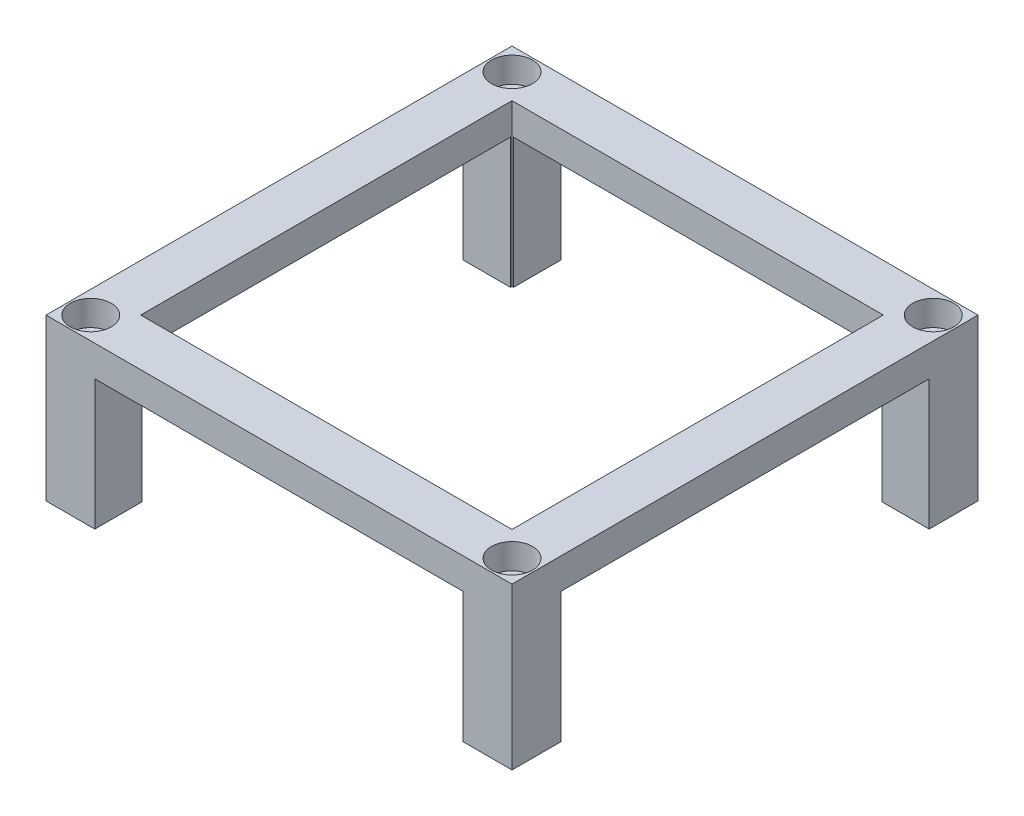
ISO-10303-21;
HEADER;
FILE_DESCRIPTION(('STEP AP214'),'2;1');
FILE_NAME('part.step','',(''),(''),'','','');
FILE_SCHEMA(('AUTOMOTIVE_DESIGN { 1 0 10303 214 1 1 1 1 }'));
ENDSEC;
DATA;
#1=APPLICATION_CONTEXT('core data for automotive mechanical design processes');
#2=APPLICATION_PROTOCOL_DEFINITION('international standard','automotive_design',2000,#1);
#3=PRODUCT_CONTEXT('',#1,'mechanical');
#4=PRODUCT('Part','Part','',(#3));
#5=PRODUCT_RELATED_PRODUCT_CATEGORY('part','',(#4));
#6=PRODUCT_DEFINITION_FORMATION('','',#4);
#7=PRODUCT_DEFINITION_CONTEXT('part definition',#1,'design');
#8=PRODUCT_DEFINITION('design','',#6,#7);
#9=PRODUCT_DEFINITION_SHAPE('','',#8);
#10=(LENGTH_UNIT() NAMED_UNIT(*) SI_UNIT(.MILLI.,.METRE.));
#11=(NAMED_UNIT(*) PLANE_ANGLE_UNIT() SI_UNIT($,.RADIAN.));
#12=(NAMED_UNIT(*) SI_UNIT($,.STERADIAN.) SOLID_ANGLE_UNIT());
#13=UNCERTAINTY_MEASURE_WITH_UNIT(LENGTH_MEASURE(1.E-05),#10,'distance_accuracy_value','');
#14=(GEOMETRIC_REPRESENTATION_CONTEXT(3) GLOBAL_UNCERTAINTY_ASSIGNED_CONTEXT((#13)) GLOBAL_UNIT_ASSIGNED_CONTEXT((#10,
#11,#12)) REPRESENTATION_CONTEXT('',''));
#15=CARTESIAN_POINT('',(0.,0.,0.));
#16=DIRECTION('',(0.,0.,1.));
#17=DIRECTION('',(1.,0.,0.));
#18=AXIS2_PLACEMENT_3D('',#15,#16,#17);
#19=CARTESIAN_POINT('',(0.,43.18,-125.));
#20=DIRECTION('',(0.,-1.,0.));
#21=DIRECTION('',(0.,0.,-1.));
#22=AXIS2_PLACEMENT_3D('',#19,#20,#21);
#23=PLANE('',#22);
#24=CARTESIAN_POINT('',(119.,43.18,-6.));
#25=DIRECTION('',(0.,1.,0.));
#26=DIRECTION('',(0.,0.,1.));
#27=AXIS2_PLACEMENT_3D('',#24,#25,#26);
#28=CIRCLE('',#27,5.50000000000001);
#29=CARTESIAN_POINT('',(119.,43.18,-0.499999999999995));
#30=VERTEX_POINT('',#29);
#31=EDGE_CURVE('E806',#30,#30,#28,.T.);
#32=ORIENTED_EDGE('',*,*,#31,.F.);
#33=EDGE_LOOP('',(#32));
#34=FACE_BOUND('',#33,.T.);
#35=CARTESIAN_POINT('',(119.,43.18,-119.));
#36=DIRECTION('',(0.,1.,0.));
#37=DIRECTION('',(0.,0.,1.));
#38=AXIS2_PLACEMENT_3D('',#35,#36,#37);
#39=CIRCLE('',#38,5.50000000000001);
#40=CARTESIAN_POINT('',(119.,43.18,-113.5));
#41=VERTEX_POINT('',#40);
#42=EDGE_CURVE('E499',#41,#41,#39,.T.);
#43=ORIENTED_EDGE('',*,*,#42,.F.);
#44=EDGE_LOOP('',(#43));
#45=FACE_BOUND('',#44,.T.);
#46=CARTESIAN_POINT('',(6.00000000000001,43.18,-119.));
#47=DIRECTION('',(0.,1.,0.));
#48=DIRECTION('',(0.,0.,1.));
#49=AXIS2_PLACEMENT_3D('',#46,#47,#48);
#50=CIRCLE('',#49,5.5);
#51=CARTESIAN_POINT('',(6.00000000000001,43.18,-113.5));
#52=VERTEX_POINT('',#51);
#53=EDGE_CURVE('E421',#52,#52,#50,.T.);
#54=ORIENTED_EDGE('',*,*,#53,.F.);
#55=EDGE_LOOP('',(#54));
#56=FACE_BOUND('',#55,.T.);
#57=DIRECTION('',(1.,0.,0.));
#58=VECTOR('',#57,1.);
#59=CARTESIAN_POINT('',(12.7,43.18,-12.7));
#60=LINE('',#59,#58);
#61=CARTESIAN_POINT('',(12.7,43.18,-12.7));
#62=VERTEX_POINT('',#61);
#63=CARTESIAN_POINT('',(112.3,43.18,-12.7));
#64=VERTEX_POINT('',#63);
#65=EDGE_CURVE('E355',#62,#64,#60,.T.);
#66=ORIENTED_EDGE('',*,*,#65,.F.);
#67=DIRECTION('',(0.,0.,1.));
#68=VECTOR('',#67,1.);
#69=CARTESIAN_POINT('',(12.7,43.18,-112.3));
#70=LINE('',#69,#68);
#71=CARTESIAN_POINT('',(12.7,43.18,-112.3));
#72=VERTEX_POINT('',#71);
#73=EDGE_CURVE('E337',#72,#62,#70,.T.);
#74=ORIENTED_EDGE('',*,*,#73,.F.);
#75=DIRECTION('',(-1.,0.,0.));
#76=VECTOR('',#75,1.);
#77=CARTESIAN_POINT('',(12.7,43.18,-112.3));
#78=LINE('',#77,#76);
#79=CARTESIAN_POINT('',(112.3,43.18,-112.3));
#80=VERTEX_POINT('',#79);
#81=EDGE_CURVE('E361',#80,#72,#78,.T.);
#82=ORIENTED_EDGE('',*,*,#81,.F.);
#83=DIRECTION('',(0.,0.,-1.));
#84=VECTOR('',#83,1.);
#85=CARTESIAN_POINT('',(112.3,43.18,-112.3));
#86=LINE('',#85,#84);
#87=EDGE_CURVE('E358',#64,#80,#86,.T.);
#88=ORIENTED_EDGE('',*,*,#87,.F.);
#89=EDGE_LOOP('',(#66,#74,#82,#88));
#90=FACE_BOUND('',#89,.T.);
#91=DIRECTION('',(0.,0.,1.));
#92=VECTOR('',#91,1.);
#93=CARTESIAN_POINT('',(0.,43.18,0.));
#94=LINE('',#93,#92);
#95=CARTESIAN_POINT('',(0.,43.18,-125.));
#96=VERTEX_POINT('',#95);
#97=CARTESIAN_POINT('',(0.,43.18,0.));
#98=VERTEX_POINT('',#97);
#99=EDGE_CURVE('E244',#96,#98,#94,.T.);
#100=ORIENTED_EDGE('',*,*,#99,.T.);
#101=DIRECTION('',(1.,0.,0.));
#102=VECTOR('',#101,1.);
#103=CARTESIAN_POINT('',(0.,43.18,0.));
#104=LINE('',#103,#102);
#105=CARTESIAN_POINT('',(125.,43.18,0.));
#106=VERTEX_POINT('',#105);
#107=EDGE_CURVE('E371',#98,#106,#104,.T.);
#108=ORIENTED_EDGE('',*,*,#107,.T.);
#109=DIRECTION('',(0.,0.,-1.));
#110=VECTOR('',#109,1.);
#111=CARTESIAN_POINT('',(125.,43.18,0.));
#112=LINE('',#111,#110);
#113=CARTESIAN_POINT('',(125.,43.18,-125.));
#114=VERTEX_POINT('',#113);
#115=EDGE_CURVE('E372',#106,#114,#112,.T.);
#116=ORIENTED_EDGE('',*,*,#115,.T.);
#117=DIRECTION('',(-1.,0.,0.));
#118=VECTOR('',#117,1.);
#119=CARTESIAN_POINT('',(0.,43.18,-125.));
#120=LINE('',#119,#118);
#121=EDGE_CURVE('E233',#114,#96,#120,.T.);
#122=ORIENTED_EDGE('',*,*,#121,.T.);
#123=EDGE_LOOP('',(#100,#108,#116,#122));
#124=FACE_BOUND('',#123,.T.);
#125=CARTESIAN_POINT('',(6.,43.18,-6.00000000000001));
#126=DIRECTION('',(0.,1.,0.));
#127=DIRECTION('',(0.,0.,1.));
#128=AXIS2_PLACEMENT_3D('',#125,#126,#127);
#129=CIRCLE('',#128,5.5);
#130=CARTESIAN_POINT('',(6.,43.18,-0.500000000000006));
#131=VERTEX_POINT('',#130);
#132=EDGE_CURVE('E791',#131,#131,#129,.T.);
#133=ORIENTED_EDGE('',*,*,#132,.F.);
#134=EDGE_LOOP('',(#133));
#135=FACE_BOUND('',#134,.T.);
#136=ADVANCED_FACE('F34',(#34,#45,#56,#90,#124,#135),#23,.F.);
#137=CARTESIAN_POINT('',(0.,0.,-125.));
#138=DIRECTION('',(0.,-1.,0.));
#139=DIRECTION('',(0.,0.,-1.));
#140=AXIS2_PLACEMENT_3D('',#137,#138,#139);
#141=PLANE('',#140);
#142=DIRECTION('',(1.,0.,0.));
#143=VECTOR('',#142,1.);
#144=CARTESIAN_POINT('',(0.,0.,-13.0925824));
#145=LINE('',#144,#143);
#146=CARTESIAN_POINT('',(112.3,0.,-13.0925824));
#147=VERTEX_POINT('',#146);
#148=CARTESIAN_POINT('',(125.,0.,-13.0925824));
#149=VERTEX_POINT('',#148);
#150=EDGE_CURVE('E207',#147,#149,#145,.T.);
#151=ORIENTED_EDGE('',*,*,#150,.T.);
#152=DIRECTION('',(0.,0.,-1.));
#153=VECTOR('',#152,1.);
#154=CARTESIAN_POINT('',(125.,0.,0.));
#155=LINE('',#154,#153);
#156=CARTESIAN_POINT('',(125.,0.,0.));
#157=VERTEX_POINT('',#156);
#158=EDGE_CURVE('E237',#157,#149,#155,.T.);
#159=ORIENTED_EDGE('',*,*,#158,.F.);
#160=DIRECTION('',(1.,0.,0.));
#161=VECTOR('',#160,1.);
#162=CARTESIAN_POINT('',(0.,0.,0.));
#163=LINE('',#162,#161);
#164=CARTESIAN_POINT('',(111.9074176,0.,0.));
#165=VERTEX_POINT('',#164);
#166=EDGE_CURVE('E228',#165,#157,#163,.T.);
#167=ORIENTED_EDGE('',*,*,#166,.F.);
#168=DIRECTION('',(0.,0.,1.));
#169=VECTOR('',#168,1.);
#170=CARTESIAN_POINT('',(111.9074176,0.,-125.));
#171=LINE('',#170,#169);
#172=CARTESIAN_POINT('',(111.9074176,0.,-12.7));
#173=VERTEX_POINT('',#172);
#174=EDGE_CURVE('E325',#173,#165,#171,.T.);
#175=ORIENTED_EDGE('',*,*,#174,.F.);
#176=DIRECTION('',(1.,0.,0.));
#177=VECTOR('',#176,1.);
#178=CARTESIAN_POINT('',(12.7,0.,-12.7));
#179=LINE('',#178,#177);
#180=CARTESIAN_POINT('',(112.3,0.,-12.7));
#181=VERTEX_POINT('',#180);
#182=EDGE_CURVE('E341',#173,#181,#179,.T.);
#183=ORIENTED_EDGE('',*,*,#182,.T.);
#184=DIRECTION('',(0.,0.,-1.));
#185=VECTOR('',#184,1.);
#186=CARTESIAN_POINT('',(112.3,0.,-112.3));
#187=LINE('',#186,#185);
#188=EDGE_CURVE('E347',#181,#147,#187,.T.);
#189=ORIENTED_EDGE('',*,*,#188,.T.);
#190=EDGE_LOOP('',(#151,#159,#167,#175,#183,#189));
#191=FACE_BOUND('',#190,.T.);
#192=CARTESIAN_POINT('',(119.,0.,-6.));
#193=DIRECTION('',(0.,1.,0.));
#194=DIRECTION('',(0.,0.,1.));
#195=AXIS2_PLACEMENT_3D('',#192,#193,#194);
#196=CIRCLE('',#195,3.29999999999998);
#197=CARTESIAN_POINT('',(119.,0.,-2.70000000000002));
#198=VERTEX_POINT('',#197);
#199=EDGE_CURVE('E797',#198,#198,#196,.T.);
#200=ORIENTED_EDGE('',*,*,#199,.T.);
#201=EDGE_LOOP('',(#200));
#202=FACE_BOUND('',#201,.T.);
#203=ADVANCED_FACE('F426',(#191,#202),#141,.T.);
#204=DIRECTION('',(1.,0.,0.));
#205=VECTOR('',#204,1.);
#206=CARTESIAN_POINT('',(0.,0.,-111.9074176));
#207=LINE('',#206,#205);
#208=CARTESIAN_POINT('',(112.3,0.,-111.9074176));
#209=VERTEX_POINT('',#208);
#210=CARTESIAN_POINT('',(125.,0.,-111.9074176));
#211=VERTEX_POINT('',#210);
#212=EDGE_CURVE('E206',#209,#211,#207,.T.);
#213=ORIENTED_EDGE('',*,*,#212,.F.);
#214=CARTESIAN_POINT('',(112.3,0.,-112.3));
#215=VERTEX_POINT('',#214);
#216=EDGE_CURVE('E346',#209,#215,#187,.T.);
#217=ORIENTED_EDGE('',*,*,#216,.T.);
#218=DIRECTION('',(-1.,0.,0.));
#219=VECTOR('',#218,1.);
#220=CARTESIAN_POINT('',(12.7,0.,-112.3));
#221=LINE('',#220,#219);
#222=CARTESIAN_POINT('',(111.9074176,0.,-112.3));
#223=VERTEX_POINT('',#222);
#224=EDGE_CURVE('E350',#215,#223,#221,.T.);
#225=ORIENTED_EDGE('',*,*,#224,.T.);
#226=CARTESIAN_POINT('',(111.9074176,0.,-125.));
#227=VERTEX_POINT('',#226);
#228=EDGE_CURVE('E323',#227,#223,#171,.T.);
#229=ORIENTED_EDGE('',*,*,#228,.F.);
#230=DIRECTION('',(-1.,0.,0.));
#231=VECTOR('',#230,1.);
#232=CARTESIAN_POINT('',(0.,0.,-125.));
#233=LINE('',#232,#231);
#234=CARTESIAN_POINT('',(125.,0.,-125.));
#235=VERTEX_POINT('',#234);
#236=EDGE_CURVE('E241',#235,#227,#233,.T.);
#237=ORIENTED_EDGE('',*,*,#236,.F.);
#238=EDGE_CURVE('E236',#211,#235,#155,.T.);
#239=ORIENTED_EDGE('',*,*,#238,.F.);
#240=EDGE_LOOP('',(#213,#217,#225,#229,#237,#239));
#241=FACE_BOUND('',#240,.T.);
#242=CARTESIAN_POINT('',(119.,0.,-119.));
#243=DIRECTION('',(0.,1.,0.));
#244=DIRECTION('',(0.,0.,1.));
#245=AXIS2_PLACEMENT_3D('',#242,#243,#244);
#246=CIRCLE('',#245,3.29999999999998);
#247=CARTESIAN_POINT('',(119.,0.,-115.7));
#248=VERTEX_POINT('',#247);
#249=EDGE_CURVE('E809',#248,#248,#246,.T.);
#250=ORIENTED_EDGE('',*,*,#249,.T.);
#251=EDGE_LOOP('',(#250));
#252=FACE_BOUND('',#251,.T.);
#253=ADVANCED_FACE('F399',(#241,#252),#141,.T.);
#254=CARTESIAN_POINT('',(6.,0.,-6.00000000000001));
#255=DIRECTION('',(0.,1.,0.));
#256=DIRECTION('',(0.,0.,1.));
#257=AXIS2_PLACEMENT_3D('',#254,#255,#256);
#258=CIRCLE('',#257,3.29999999999999);
#259=CARTESIAN_POINT('',(6.,0.,-2.70000000000002));
#260=VERTEX_POINT('',#259);
#261=EDGE_CURVE('E784',#260,#260,#258,.T.);
#262=ORIENTED_EDGE('',*,*,#261,.T.);
#263=EDGE_LOOP('',(#262));
#264=FACE_BOUND('',#263,.T.);
#265=CARTESIAN_POINT('',(0.,0.,-13.0925824));
#266=VERTEX_POINT('',#265);
#267=CARTESIAN_POINT('',(12.7,0.,-13.0925824));
#268=VERTEX_POINT('',#267);
#269=EDGE_CURVE('E195',#266,#268,#145,.T.);
#270=ORIENTED_EDGE('',*,*,#269,.T.);
#271=DIRECTION('',(0.,0.,1.));
#272=VECTOR('',#271,1.);
#273=CARTESIAN_POINT('',(12.7,0.,-112.3));
#274=LINE('',#273,#272);
#275=CARTESIAN_POINT('',(12.7,0.,-12.7));
#276=VERTEX_POINT('',#275);
#277=EDGE_CURVE('E342',#268,#276,#274,.T.);
#278=ORIENTED_EDGE('',*,*,#277,.T.);
#279=CARTESIAN_POINT('',(13.0925824,0.,-12.7));
#280=VERTEX_POINT('',#279);
#281=EDGE_CURVE('E343',#276,#280,#179,.T.);
#282=ORIENTED_EDGE('',*,*,#281,.T.);
#283=DIRECTION('',(0.,0.,1.));
#284=VECTOR('',#283,1.);
#285=CARTESIAN_POINT('',(13.0925824,0.,-125.));
#286=LINE('',#285,#284);
#287=CARTESIAN_POINT('',(13.0925824,0.,0.));
#288=VERTEX_POINT('',#287);
#289=EDGE_CURVE('E307',#280,#288,#286,.T.);
#290=ORIENTED_EDGE('',*,*,#289,.T.);
#291=CARTESIAN_POINT('',(0.,0.,0.));
#292=VERTEX_POINT('',#291);
#293=EDGE_CURVE('E222',#292,#288,#163,.T.);
#294=ORIENTED_EDGE('',*,*,#293,.F.);
#295=DIRECTION('',(0.,0.,1.));
#296=VECTOR('',#295,1.);
#297=CARTESIAN_POINT('',(0.,0.,0.));
#298=LINE('',#297,#296);
#299=EDGE_CURVE('E211',#266,#292,#298,.T.);
#300=ORIENTED_EDGE('',*,*,#299,.F.);
#301=EDGE_LOOP('',(#270,#278,#282,#290,#294,#300));
#302=FACE_BOUND('',#301,.T.);
#303=ADVANCED_FACE('F219',(#264,#302),#141,.T.);
#304=CARTESIAN_POINT('',(6.00000000000001,0.,-119.));
#305=DIRECTION('',(0.,1.,0.));
#306=DIRECTION('',(0.,0.,1.));
#307=AXIS2_PLACEMENT_3D('',#304,#305,#306);
#308=CIRCLE('',#307,3.29999999999999);
#309=CARTESIAN_POINT('',(6.00000000000001,0.,-115.7));
#310=VERTEX_POINT('',#309);
#311=EDGE_CURVE('E496',#310,#310,#308,.T.);
#312=ORIENTED_EDGE('',*,*,#311,.T.);
#313=EDGE_LOOP('',(#312));
#314=FACE_BOUND('',#313,.T.);
#315=CARTESIAN_POINT('',(0.,0.,-111.9074176));
#316=VERTEX_POINT('',#315);
#317=CARTESIAN_POINT('',(12.7,0.,-111.9074176));
#318=VERTEX_POINT('',#317);
#319=EDGE_CURVE('E49',#316,#318,#207,.T.);
#320=ORIENTED_EDGE('',*,*,#319,.F.);
#321=CARTESIAN_POINT('',(0.,0.,-125.));
#322=VERTEX_POINT('',#321);
#323=EDGE_CURVE('E224',#322,#316,#298,.T.);
#324=ORIENTED_EDGE('',*,*,#323,.F.);
#325=CARTESIAN_POINT('',(13.0925824,0.,-125.));
#326=VERTEX_POINT('',#325);
#327=EDGE_CURVE('E240',#326,#322,#233,.T.);
#328=ORIENTED_EDGE('',*,*,#327,.F.);
#329=CARTESIAN_POINT('',(13.0925824,0.,-112.3));
#330=VERTEX_POINT('',#329);
#331=EDGE_CURVE('E326',#326,#330,#286,.T.);
#332=ORIENTED_EDGE('',*,*,#331,.T.);
#333=CARTESIAN_POINT('',(12.7,0.,-112.3));
#334=VERTEX_POINT('',#333);
#335=EDGE_CURVE('E349',#330,#334,#221,.T.);
#336=ORIENTED_EDGE('',*,*,#335,.T.);
#337=EDGE_CURVE('E338',#334,#318,#274,.T.);
#338=ORIENTED_EDGE('',*,*,#337,.T.);
#339=EDGE_LOOP('',(#320,#324,#328,#332,#336,#338));
#340=FACE_BOUND('',#339,.T.);
#341=ADVANCED_FACE('F414',(#314,#340),#141,.T.);
#342=CARTESIAN_POINT('',(0.,43.18,0.));
#343=DIRECTION('',(1.,0.,0.));
#344=DIRECTION('',(0.,0.,-1.));
#345=AXIS2_PLACEMENT_3D('',#342,#343,#344);
#346=PLANE('',#345);
#347=DIRECTION('',(0.,0.,1.));
#348=VECTOR('',#347,1.);
#349=CARTESIAN_POINT('',(0.,34.925,-13.0925824));
#350=LINE('',#349,#348);
#351=CARTESIAN_POINT('',(0.,34.925,-111.9074176));
#352=VERTEX_POINT('',#351);
#353=CARTESIAN_POINT('',(0.,34.925,-13.0925824));
#354=VERTEX_POINT('',#353);
#355=EDGE_CURVE('E215',#352,#354,#350,.T.);
#356=ORIENTED_EDGE('',*,*,#355,.T.);
#357=DIRECTION('',(0.,-1.,0.));
#358=VECTOR('',#357,1.);
#359=CARTESIAN_POINT('',(0.,0.,-13.0925824));
#360=LINE('',#359,#358);
#361=EDGE_CURVE('E199',#354,#266,#360,.T.);
#362=ORIENTED_EDGE('',*,*,#361,.T.);
#363=ORIENTED_EDGE('',*,*,#299,.T.);
#364=DIRECTION('',(0.,-1.,0.));
#365=VECTOR('',#364,1.);
#366=CARTESIAN_POINT('',(0.,43.18,0.));
#367=LINE('',#366,#365);
#368=EDGE_CURVE('E254',#98,#292,#367,.T.);
#369=ORIENTED_EDGE('',*,*,#368,.F.);
#370=ORIENTED_EDGE('',*,*,#99,.F.);
#371=DIRECTION('',(0.,-1.,0.));
#372=VECTOR('',#371,1.);
#373=CARTESIAN_POINT('',(0.,43.18,-125.));
#374=LINE('',#373,#372);
#375=EDGE_CURVE('E245',#96,#322,#374,.T.);
#376=ORIENTED_EDGE('',*,*,#375,.T.);
#377=ORIENTED_EDGE('',*,*,#323,.T.);
#378=DIRECTION('',(0.,1.,0.));
#379=VECTOR('',#378,1.);
#380=CARTESIAN_POINT('',(0.,0.,-111.9074176));
#381=LINE('',#380,#379);
#382=EDGE_CURVE('E216',#316,#352,#381,.T.);
#383=ORIENTED_EDGE('',*,*,#382,.T.);
#384=EDGE_LOOP('',(#356,#362,#363,#369,#370,#376,#377,#383));
#385=FACE_BOUND('',#384,.T.);
#386=ADVANCED_FACE('F36',(#385),#346,.F.);
#387=CARTESIAN_POINT('',(0.,43.18,0.));
#388=DIRECTION('',(0.,0.,-1.));
#389=DIRECTION('',(-1.,0.,0.));
#390=AXIS2_PLACEMENT_3D('',#387,#388,#389);
#391=PLANE('',#390);
#392=ORIENTED_EDGE('',*,*,#293,.T.);
#393=DIRECTION('',(0.,-1.,0.));
#394=VECTOR('',#393,1.);
#395=CARTESIAN_POINT('',(13.0925824,0.,0.));
#396=LINE('',#395,#394);
#397=CARTESIAN_POINT('',(13.0925824,34.925,0.));
#398=VERTEX_POINT('',#397);
#399=EDGE_CURVE('E296',#398,#288,#396,.T.);
#400=ORIENTED_EDGE('',*,*,#399,.F.);
#401=DIRECTION('',(-1.,0.,0.));
#402=VECTOR('',#401,1.);
#403=CARTESIAN_POINT('',(13.0925824,34.925,0.));
#404=LINE('',#403,#402);
#405=CARTESIAN_POINT('',(111.9074176,34.925,0.));
#406=VERTEX_POINT('',#405);
#407=EDGE_CURVE('E301',#406,#398,#404,.T.);
#408=ORIENTED_EDGE('',*,*,#407,.F.);
#409=DIRECTION('',(0.,1.,0.));
#410=VECTOR('',#409,1.);
#411=CARTESIAN_POINT('',(111.9074176,0.,0.));
#412=LINE('',#411,#410);
#413=EDGE_CURVE('E309',#165,#406,#412,.T.);
#414=ORIENTED_EDGE('',*,*,#413,.F.);
#415=ORIENTED_EDGE('',*,*,#166,.T.);
#416=DIRECTION('',(0.,-1.,0.));
#417=VECTOR('',#416,1.);
#418=CARTESIAN_POINT('',(125.,43.18,0.));
#419=LINE('',#418,#417);
#420=EDGE_CURVE('E251',#106,#157,#419,.T.);
#421=ORIENTED_EDGE('',*,*,#420,.F.);
#422=ORIENTED_EDGE('',*,*,#107,.F.);
#423=ORIENTED_EDGE('',*,*,#368,.T.);
#424=EDGE_LOOP('',(#392,#400,#408,#414,#415,#421,#422,#423));
#425=FACE_BOUND('',#424,.T.);
#426=ADVANCED_FACE('F385',(#425),#391,.F.);
#427=CARTESIAN_POINT('',(125.,43.18,0.));
#428=DIRECTION('',(-1.,0.,0.));
#429=DIRECTION('',(0.,0.,1.));
#430=AXIS2_PLACEMENT_3D('',#427,#428,#429);
#431=PLANE('',#430);
#432=ORIENTED_EDGE('',*,*,#158,.T.);
#433=DIRECTION('',(0.,-1.,0.));
#434=VECTOR('',#433,1.);
#435=CARTESIAN_POINT('',(125.,0.,-13.0925824));
#436=LINE('',#435,#434);
#437=CARTESIAN_POINT('',(125.,34.925,-13.0925824));
#438=VERTEX_POINT('',#437);
#439=EDGE_CURVE('E419',#438,#149,#436,.T.);
#440=ORIENTED_EDGE('',*,*,#439,.F.);
#441=DIRECTION('',(0.,0.,1.));
#442=VECTOR('',#441,1.);
#443=CARTESIAN_POINT('',(125.,34.925,-13.0925824));
#444=LINE('',#443,#442);
#445=CARTESIAN_POINT('',(125.,34.925,-111.9074176));
#446=VERTEX_POINT('',#445);
#447=EDGE_CURVE('E217',#446,#438,#444,.T.);
#448=ORIENTED_EDGE('',*,*,#447,.F.);
#449=DIRECTION('',(0.,1.,0.));
#450=VECTOR('',#449,1.);
#451=CARTESIAN_POINT('',(125.,0.,-111.9074176));
#452=LINE('',#451,#450);
#453=EDGE_CURVE('E420',#211,#446,#452,.T.);
#454=ORIENTED_EDGE('',*,*,#453,.F.);
#455=ORIENTED_EDGE('',*,*,#238,.T.);
#456=DIRECTION('',(0.,-1.,0.));
#457=VECTOR('',#456,1.);
#458=CARTESIAN_POINT('',(125.,43.18,-125.));
#459=LINE('',#458,#457);
#460=EDGE_CURVE('E248',#114,#235,#459,.T.);
#461=ORIENTED_EDGE('',*,*,#460,.F.);
#462=ORIENTED_EDGE('',*,*,#115,.F.);
#463=ORIENTED_EDGE('',*,*,#420,.T.);
#464=EDGE_LOOP('',(#432,#440,#448,#454,#455,#461,#462,#463));
#465=FACE_BOUND('',#464,.T.);
#466=ADVANCED_FACE('F392',(#465),#431,.F.);
#467=CARTESIAN_POINT('',(0.,43.18,-125.));
#468=DIRECTION('',(0.,0.,1.));
#469=DIRECTION('',(1.,0.,0.));
#470=AXIS2_PLACEMENT_3D('',#467,#468,#469);
#471=PLANE('',#470);
#472=DIRECTION('',(-1.,0.,0.));
#473=VECTOR('',#472,1.);
#474=CARTESIAN_POINT('',(13.0925824,34.925,-125.));
#475=LINE('',#474,#473);
#476=CARTESIAN_POINT('',(111.9074176,34.925,-125.));
#477=VERTEX_POINT('',#476);
#478=CARTESIAN_POINT('',(13.0925824,34.925,-125.));
#479=VERTEX_POINT('',#478);
#480=EDGE_CURVE('E304',#477,#479,#475,.T.);
#481=ORIENTED_EDGE('',*,*,#480,.T.);
#482=DIRECTION('',(0.,-1.,0.));
#483=VECTOR('',#482,1.);
#484=CARTESIAN_POINT('',(13.0925824,0.,-125.));
#485=LINE('',#484,#483);
#486=EDGE_CURVE('E297',#479,#326,#485,.T.);
#487=ORIENTED_EDGE('',*,*,#486,.T.);
#488=ORIENTED_EDGE('',*,*,#327,.T.);
#489=ORIENTED_EDGE('',*,*,#375,.F.);
#490=ORIENTED_EDGE('',*,*,#121,.F.);
#491=ORIENTED_EDGE('',*,*,#460,.T.);
#492=ORIENTED_EDGE('',*,*,#236,.T.);
#493=DIRECTION('',(0.,1.,0.));
#494=VECTOR('',#493,1.);
#495=CARTESIAN_POINT('',(111.9074176,0.,-125.));
#496=LINE('',#495,#494);
#497=EDGE_CURVE('E300',#227,#477,#496,.T.);
#498=ORIENTED_EDGE('',*,*,#497,.T.);
#499=EDGE_LOOP('',(#481,#487,#488,#489,#490,#491,#492,#498));
#500=FACE_BOUND('',#499,.T.);
#501=ADVANCED_FACE('F381',(#500),#471,.F.);
#502=CARTESIAN_POINT('',(12.7,0.,-112.3));
#503=DIRECTION('',(-1.,0.,0.));
#504=DIRECTION('',(0.,0.,1.));
#505=AXIS2_PLACEMENT_3D('',#502,#503,#504);
#506=PLANE('',#505);
#507=ORIENTED_EDGE('',*,*,#277,.F.);
#508=DIRECTION('',(0.,1.,0.));
#509=VECTOR('',#508,1.);
#510=CARTESIAN_POINT('',(12.7,0.,-13.0925824));
#511=LINE('',#510,#509);
#512=CARTESIAN_POINT('',(12.7,34.925,-13.0925824));
#513=VERTEX_POINT('',#512);
#514=EDGE_CURVE('E202',#268,#513,#511,.T.);
#515=ORIENTED_EDGE('',*,*,#514,.T.);
#516=DIRECTION('',(0.,0.,-1.));
#517=VECTOR('',#516,1.);
#518=CARTESIAN_POINT('',(12.7,34.925,-112.3));
#519=LINE('',#518,#517);
#520=CARTESIAN_POINT('',(12.7,34.925,-111.9074176));
#521=VERTEX_POINT('',#520);
#522=EDGE_CURVE('E292',#513,#521,#519,.T.);
#523=ORIENTED_EDGE('',*,*,#522,.T.);
#524=DIRECTION('',(0.,-1.,0.));
#525=VECTOR('',#524,1.);
#526=CARTESIAN_POINT('',(12.7,0.,-111.9074176));
#527=LINE('',#526,#525);
#528=EDGE_CURVE('E284',#521,#318,#527,.T.);
#529=ORIENTED_EDGE('',*,*,#528,.T.);
#530=ORIENTED_EDGE('',*,*,#337,.F.);
#531=DIRECTION('',(0.,1.,0.));
#532=VECTOR('',#531,1.);
#533=CARTESIAN_POINT('',(12.7,0.,-112.3));
#534=LINE('',#533,#532);
#535=EDGE_CURVE('E225',#334,#72,#534,.T.);
#536=ORIENTED_EDGE('',*,*,#535,.T.);
#537=ORIENTED_EDGE('',*,*,#73,.T.);
#538=DIRECTION('',(0.,1.,0.));
#539=VECTOR('',#538,1.);
#540=CARTESIAN_POINT('',(12.7,0.,-12.7));
#541=LINE('',#540,#539);
#542=EDGE_CURVE('E353',#276,#62,#541,.T.);
#543=ORIENTED_EDGE('',*,*,#542,.F.);
#544=EDGE_LOOP('',(#507,#515,#523,#529,#530,#536,#537,#543));
#545=FACE_BOUND('',#544,.T.);
#546=ADVANCED_FACE('F444',(#545),#506,.F.);
#547=CARTESIAN_POINT('',(12.7,0.,-112.3));
#548=DIRECTION('',(0.,0.,-1.));
#549=DIRECTION('',(-1.,0.,0.));
#550=AXIS2_PLACEMENT_3D('',#547,#548,#549);
#551=PLANE('',#550);
#552=ORIENTED_EDGE('',*,*,#335,.F.);
#553=DIRECTION('',(0.,1.,0.));
#554=VECTOR('',#553,1.);
#555=CARTESIAN_POINT('',(13.0925824,0.,-112.3));
#556=LINE('',#555,#554);
#557=CARTESIAN_POINT('',(13.0925824,34.925,-112.3));
#558=VERTEX_POINT('',#557);
#559=EDGE_CURVE('E334',#330,#558,#556,.T.);
#560=ORIENTED_EDGE('',*,*,#559,.T.);
#561=DIRECTION('',(1.,0.,0.));
#562=VECTOR('',#561,1.);
#563=CARTESIAN_POINT('',(12.7,34.925,-112.3));
#564=LINE('',#563,#562);
#565=CARTESIAN_POINT('',(111.9074176,34.925,-112.3));
#566=VERTEX_POINT('',#565);
#567=EDGE_CURVE('E331',#558,#566,#564,.T.);
#568=ORIENTED_EDGE('',*,*,#567,.T.);
#569=DIRECTION('',(0.,-1.,0.));
#570=VECTOR('',#569,1.);
#571=CARTESIAN_POINT('',(111.9074176,0.,-112.3));
#572=LINE('',#571,#570);
#573=EDGE_CURVE('E317',#566,#223,#572,.T.);
#574=ORIENTED_EDGE('',*,*,#573,.T.);
#575=ORIENTED_EDGE('',*,*,#224,.F.);
#576=DIRECTION('',(0.,1.,0.));
#577=VECTOR('',#576,1.);
#578=CARTESIAN_POINT('',(112.3,0.,-112.3));
#579=LINE('',#578,#577);
#580=EDGE_CURVE('E229',#215,#80,#579,.T.);
#581=ORIENTED_EDGE('',*,*,#580,.T.);
#582=ORIENTED_EDGE('',*,*,#81,.T.);
#583=ORIENTED_EDGE('',*,*,#535,.F.);
#584=EDGE_LOOP('',(#552,#560,#568,#574,#575,#581,#582,#583));
#585=FACE_BOUND('',#584,.T.);
#586=ADVANCED_FACE('F406',(#585),#551,.F.);
#587=CARTESIAN_POINT('',(112.3,0.,-112.3));
#588=DIRECTION('',(1.,0.,0.));
#589=DIRECTION('',(0.,0.,-1.));
#590=AXIS2_PLACEMENT_3D('',#587,#588,#589);
#591=PLANE('',#590);
#592=DIRECTION('',(0.,0.,1.));
#593=VECTOR('',#592,1.);
#594=CARTESIAN_POINT('',(112.3,34.925,-112.3));
#595=LINE('',#594,#593);
#596=CARTESIAN_POINT('',(112.3,34.925,-111.9074176));
#597=VERTEX_POINT('',#596);
#598=CARTESIAN_POINT('',(112.3,34.925,-13.0925824));
#599=VERTEX_POINT('',#598);
#600=EDGE_CURVE('E42',#597,#599,#595,.T.);
#601=ORIENTED_EDGE('',*,*,#600,.T.);
#602=DIRECTION('',(0.,-1.,0.));
#603=VECTOR('',#602,1.);
#604=CARTESIAN_POINT('',(112.3,0.,-13.0925824));
#605=LINE('',#604,#603);
#606=EDGE_CURVE('E11',#599,#147,#605,.T.);
#607=ORIENTED_EDGE('',*,*,#606,.T.);
#608=ORIENTED_EDGE('',*,*,#188,.F.);
#609=DIRECTION('',(0.,1.,0.));
#610=VECTOR('',#609,1.);
#611=CARTESIAN_POINT('',(112.3,0.,-12.7));
#612=LINE('',#611,#610);
#613=EDGE_CURVE('E365',#181,#64,#612,.T.);
#614=ORIENTED_EDGE('',*,*,#613,.T.);
#615=ORIENTED_EDGE('',*,*,#87,.T.);
#616=ORIENTED_EDGE('',*,*,#580,.F.);
#617=ORIENTED_EDGE('',*,*,#216,.F.);
#618=DIRECTION('',(0.,1.,0.));
#619=VECTOR('',#618,1.);
#620=CARTESIAN_POINT('',(112.3,0.,-111.9074176));
#621=LINE('',#620,#619);
#622=EDGE_CURVE('E265',#209,#597,#621,.T.);
#623=ORIENTED_EDGE('',*,*,#622,.T.);
#624=EDGE_LOOP('',(#601,#607,#608,#614,#615,#616,#617,#623));
#625=FACE_BOUND('',#624,.T.);
#626=ADVANCED_FACE('F269',(#625),#591,.F.);
#627=CARTESIAN_POINT('',(12.7,0.,-12.7));
#628=DIRECTION('',(0.,0.,1.));
#629=DIRECTION('',(1.,0.,0.));
#630=AXIS2_PLACEMENT_3D('',#627,#628,#629);
#631=PLANE('',#630);
#632=DIRECTION('',(-1.,0.,0.));
#633=VECTOR('',#632,1.);
#634=CARTESIAN_POINT('',(12.7,34.925,-12.7));
#635=LINE('',#634,#633);
#636=CARTESIAN_POINT('',(111.9074176,34.925,-12.7));
#637=VERTEX_POINT('',#636);
#638=CARTESIAN_POINT('',(13.0925824,34.925,-12.7));
#639=VERTEX_POINT('',#638);
#640=EDGE_CURVE('E259',#637,#639,#635,.T.);
#641=ORIENTED_EDGE('',*,*,#640,.T.);
#642=DIRECTION('',(0.,-1.,0.));
#643=VECTOR('',#642,1.);
#644=CARTESIAN_POINT('',(13.0925824,0.,-12.7));
#645=LINE('',#644,#643);
#646=EDGE_CURVE('E262',#639,#280,#645,.T.);
#647=ORIENTED_EDGE('',*,*,#646,.T.);
#648=ORIENTED_EDGE('',*,*,#281,.F.);
#649=ORIENTED_EDGE('',*,*,#542,.T.);
#650=ORIENTED_EDGE('',*,*,#65,.T.);
#651=ORIENTED_EDGE('',*,*,#613,.F.);
#652=ORIENTED_EDGE('',*,*,#182,.F.);
#653=DIRECTION('',(0.,1.,0.));
#654=VECTOR('',#653,1.);
#655=CARTESIAN_POINT('',(111.9074176,0.,-12.7));
#656=LINE('',#655,#654);
#657=EDGE_CURVE('E256',#173,#637,#656,.T.);
#658=ORIENTED_EDGE('',*,*,#657,.T.);
#659=EDGE_LOOP('',(#641,#647,#648,#649,#650,#651,#652,#658));
#660=FACE_BOUND('',#659,.T.);
#661=ADVANCED_FACE('F432',(#660),#631,.F.);
#662=CARTESIAN_POINT('',(111.9074176,0.,-125.));
#663=DIRECTION('',(1.,0.,0.));
#664=DIRECTION('',(0.,0.,-1.));
#665=AXIS2_PLACEMENT_3D('',#662,#663,#664);
#666=PLANE('',#665);
#667=ORIENTED_EDGE('',*,*,#174,.T.);
#668=ORIENTED_EDGE('',*,*,#413,.T.);
#669=DIRECTION('',(0.,0.,1.));
#670=VECTOR('',#669,1.);
#671=CARTESIAN_POINT('',(111.9074176,34.925,-125.));
#672=LINE('',#671,#670);
#673=EDGE_CURVE('E322',#637,#406,#672,.T.);
#674=ORIENTED_EDGE('',*,*,#673,.F.);
#675=ORIENTED_EDGE('',*,*,#657,.F.);
#676=EDGE_LOOP('',(#667,#668,#674,#675));
#677=FACE_BOUND('',#676,.T.);
#678=ADVANCED_FACE('F456',(#677),#666,.F.);
#679=CARTESIAN_POINT('',(13.0925824,34.925,-125.));
#680=DIRECTION('',(0.,1.,0.));
#681=DIRECTION('',(0.,0.,1.));
#682=AXIS2_PLACEMENT_3D('',#679,#680,#681);
#683=PLANE('',#682);
#684=ORIENTED_EDGE('',*,*,#673,.T.);
#685=ORIENTED_EDGE('',*,*,#407,.T.);
#686=DIRECTION('',(0.,0.,1.));
#687=VECTOR('',#686,1.);
#688=CARTESIAN_POINT('',(13.0925824,34.925,-125.));
#689=LINE('',#688,#687);
#690=EDGE_CURVE('E318',#639,#398,#689,.T.);
#691=ORIENTED_EDGE('',*,*,#690,.F.);
#692=ORIENTED_EDGE('',*,*,#640,.F.);
#693=EDGE_LOOP('',(#684,#685,#691,#692));
#694=FACE_BOUND('',#693,.T.);
#695=ADVANCED_FACE('F453',(#694),#683,.F.);
#696=CARTESIAN_POINT('',(13.0925824,0.,-125.));
#697=DIRECTION('',(-1.,0.,0.));
#698=DIRECTION('',(0.,0.,1.));
#699=AXIS2_PLACEMENT_3D('',#696,#697,#698);
#700=PLANE('',#699);
#701=ORIENTED_EDGE('',*,*,#690,.T.);
#702=ORIENTED_EDGE('',*,*,#399,.T.);
#703=ORIENTED_EDGE('',*,*,#289,.F.);
#704=ORIENTED_EDGE('',*,*,#646,.F.);
#705=EDGE_LOOP('',(#701,#702,#703,#704));
#706=FACE_BOUND('',#705,.T.);
#707=ADVANCED_FACE('F451',(#706),#700,.F.);
#708=ORIENTED_EDGE('',*,*,#331,.F.);
#709=ORIENTED_EDGE('',*,*,#486,.F.);
#710=EDGE_CURVE('E314',#479,#558,#689,.T.);
#711=ORIENTED_EDGE('',*,*,#710,.T.);
#712=ORIENTED_EDGE('',*,*,#559,.F.);
#713=EDGE_LOOP('',(#708,#709,#711,#712));
#714=FACE_BOUND('',#713,.T.);
#715=ADVANCED_FACE('F412',(#714),#700,.F.);
#716=ORIENTED_EDGE('',*,*,#710,.F.);
#717=ORIENTED_EDGE('',*,*,#480,.F.);
#718=EDGE_CURVE('E319',#477,#566,#672,.T.);
#719=ORIENTED_EDGE('',*,*,#718,.T.);
#720=ORIENTED_EDGE('',*,*,#567,.F.);
#721=EDGE_LOOP('',(#716,#717,#719,#720));
#722=FACE_BOUND('',#721,.T.);
#723=ADVANCED_FACE('F408',(#722),#683,.F.);
#724=ORIENTED_EDGE('',*,*,#718,.F.);
#725=ORIENTED_EDGE('',*,*,#497,.F.);
#726=ORIENTED_EDGE('',*,*,#228,.T.);
#727=ORIENTED_EDGE('',*,*,#573,.F.);
#728=EDGE_LOOP('',(#724,#725,#726,#727));
#729=FACE_BOUND('',#728,.T.);
#730=ADVANCED_FACE('F403',(#729),#666,.F.);
#731=CARTESIAN_POINT('',(0.,0.,-111.9074176));
#732=DIRECTION('',(0.,0.,-1.));
#733=DIRECTION('',(-1.,0.,0.));
#734=AXIS2_PLACEMENT_3D('',#731,#732,#733);
#735=PLANE('',#734);
#736=ORIENTED_EDGE('',*,*,#212,.T.);
#737=ORIENTED_EDGE('',*,*,#453,.T.);
#738=DIRECTION('',(1.,0.,0.));
#739=VECTOR('',#738,1.);
#740=CARTESIAN_POINT('',(0.,34.925,-111.9074176));
#741=LINE('',#740,#739);
#742=EDGE_CURVE('E57',#597,#446,#741,.T.);
#743=ORIENTED_EDGE('',*,*,#742,.F.);
#744=ORIENTED_EDGE('',*,*,#622,.F.);
#745=EDGE_LOOP('',(#736,#737,#743,#744));
#746=FACE_BOUND('',#745,.T.);
#747=ADVANCED_FACE('F422',(#746),#735,.F.);
#748=CARTESIAN_POINT('',(0.,34.925,-13.0925824));
#749=DIRECTION('',(0.,1.,0.));
#750=DIRECTION('',(0.,0.,1.));
#751=AXIS2_PLACEMENT_3D('',#748,#749,#750);
#752=PLANE('',#751);
#753=ORIENTED_EDGE('',*,*,#742,.T.);
#754=ORIENTED_EDGE('',*,*,#447,.T.);
#755=DIRECTION('',(1.,0.,0.));
#756=VECTOR('',#755,1.);
#757=CARTESIAN_POINT('',(0.,34.925,-13.0925824));
#758=LINE('',#757,#756);
#759=EDGE_CURVE('E277',#599,#438,#758,.T.);
#760=ORIENTED_EDGE('',*,*,#759,.F.);
#761=ORIENTED_EDGE('',*,*,#600,.F.);
#762=EDGE_LOOP('',(#753,#754,#760,#761));
#763=FACE_BOUND('',#762,.T.);
#764=ADVANCED_FACE('F275',(#763),#752,.F.);
#765=CARTESIAN_POINT('',(0.,0.,-13.0925824));
#766=DIRECTION('',(0.,0.,1.));
#767=DIRECTION('',(1.,0.,0.));
#768=AXIS2_PLACEMENT_3D('',#765,#766,#767);
#769=PLANE('',#768);
#770=ORIENTED_EDGE('',*,*,#759,.T.);
#771=ORIENTED_EDGE('',*,*,#439,.T.);
#772=ORIENTED_EDGE('',*,*,#150,.F.);
#773=ORIENTED_EDGE('',*,*,#606,.F.);
#774=EDGE_LOOP('',(#770,#771,#772,#773));
#775=FACE_BOUND('',#774,.T.);
#776=ADVANCED_FACE('F424',(#775),#769,.F.);
#777=ORIENTED_EDGE('',*,*,#269,.F.);
#778=ORIENTED_EDGE('',*,*,#361,.F.);
#779=EDGE_CURVE('E281',#354,#513,#758,.T.);
#780=ORIENTED_EDGE('',*,*,#779,.T.);
#781=ORIENTED_EDGE('',*,*,#514,.F.);
#782=EDGE_LOOP('',(#777,#778,#780,#781));
#783=FACE_BOUND('',#782,.T.);
#784=ADVANCED_FACE('F197',(#783),#769,.F.);
#785=ORIENTED_EDGE('',*,*,#779,.F.);
#786=ORIENTED_EDGE('',*,*,#355,.F.);
#787=EDGE_CURVE('E282',#352,#521,#741,.T.);
#788=ORIENTED_EDGE('',*,*,#787,.T.);
#789=ORIENTED_EDGE('',*,*,#522,.F.);
#790=EDGE_LOOP('',(#785,#786,#788,#789));
#791=FACE_BOUND('',#790,.T.);
#792=ADVANCED_FACE('F447',(#791),#752,.F.);
#793=ORIENTED_EDGE('',*,*,#787,.F.);
#794=ORIENTED_EDGE('',*,*,#382,.F.);
#795=ORIENTED_EDGE('',*,*,#319,.T.);
#796=ORIENTED_EDGE('',*,*,#528,.F.);
#797=EDGE_LOOP('',(#793,#794,#795,#796));
#798=FACE_BOUND('',#797,.T.);
#799=ADVANCED_FACE('F445',(#798),#735,.F.);
#800=CARTESIAN_POINT('',(6.00000000000001,43.18,-119.));
#801=DIRECTION('',(0.,1.,0.));
#802=DIRECTION('',(0.,0.,1.));
#803=AXIS2_PLACEMENT_3D('',#800,#801,#802);
#804=CYLINDRICAL_SURFACE('',#803,5.5);
#805=CARTESIAN_POINT('',(6.00000000000001,36.38,-119.));
#806=DIRECTION('',(0.,1.,0.));
#807=DIRECTION('',(0.,0.,1.));
#808=AXIS2_PLACEMENT_3D('',#805,#806,#807);
#809=CIRCLE('',#808,5.5);
#810=CARTESIAN_POINT('',(6.00000000000001,36.38,-113.5));
#811=VERTEX_POINT('',#810);
#812=EDGE_CURVE('E502',#811,#811,#809,.T.);
#813=ORIENTED_EDGE('',*,*,#812,.F.);
#814=EDGE_LOOP('',(#813));
#815=FACE_BOUND('',#814,.T.);
#816=ORIENTED_EDGE('',*,*,#53,.T.);
#817=EDGE_LOOP('',(#816));
#818=FACE_BOUND('',#817,.T.);
#819=ADVANCED_FACE('F513',(#815,#818),#804,.F.);
#820=CARTESIAN_POINT('',(9.30000000000001,36.38,-119.));
#821=DIRECTION('',(0.,-1.,0.));
#822=DIRECTION('',(0.,0.,-1.));
#823=AXIS2_PLACEMENT_3D('',#820,#821,#822);
#824=PLANE('',#823);
#825=CARTESIAN_POINT('',(6.00000000000001,36.38,-119.));
#826=DIRECTION('',(0.,1.,0.));
#827=DIRECTION('',(0.,0.,1.));
#828=AXIS2_PLACEMENT_3D('',#825,#826,#827);
#829=CIRCLE('',#828,3.3);
#830=CARTESIAN_POINT('',(6.00000000000001,36.38,-115.7));
#831=VERTEX_POINT('',#830);
#832=EDGE_CURVE('E498',#831,#831,#829,.T.);
#833=ORIENTED_EDGE('',*,*,#832,.F.);
#834=EDGE_LOOP('',(#833));
#835=FACE_BOUND('',#834,.T.);
#836=ORIENTED_EDGE('',*,*,#812,.T.);
#837=EDGE_LOOP('',(#836));
#838=FACE_BOUND('',#837,.T.);
#839=ADVANCED_FACE('F516',(#835,#838),#824,.F.);
#840=CARTESIAN_POINT('',(6.00000000000001,43.18,-119.));
#841=DIRECTION('',(0.,1.,0.));
#842=DIRECTION('',(0.,0.,1.));
#843=AXIS2_PLACEMENT_3D('',#840,#841,#842);
#844=CYLINDRICAL_SURFACE('',#843,3.3);
#845=ORIENTED_EDGE('',*,*,#311,.F.);
#846=EDGE_LOOP('',(#845));
#847=FACE_BOUND('',#846,.T.);
#848=ORIENTED_EDGE('',*,*,#832,.T.);
#849=EDGE_LOOP('',(#848));
#850=FACE_BOUND('',#849,.T.);
#851=ADVANCED_FACE('F523',(#847,#850),#844,.F.);
#852=CARTESIAN_POINT('',(119.,43.18,-119.));
#853=DIRECTION('',(0.,1.,0.));
#854=DIRECTION('',(0.,0.,1.));
#855=AXIS2_PLACEMENT_3D('',#852,#853,#854);
#856=CYLINDRICAL_SURFACE('',#855,5.50000000000001);
#857=CARTESIAN_POINT('',(119.,36.38,-119.));
#858=DIRECTION('',(0.,1.,0.));
#859=DIRECTION('',(0.,0.,1.));
#860=AXIS2_PLACEMENT_3D('',#857,#858,#859);
#861=CIRCLE('',#860,5.50000000000001);
#862=CARTESIAN_POINT('',(119.,36.38,-113.5));
#863=VERTEX_POINT('',#862);
#864=EDGE_CURVE('E505',#863,#863,#861,.T.);
#865=ORIENTED_EDGE('',*,*,#864,.F.);
#866=EDGE_LOOP('',(#865));
#867=FACE_BOUND('',#866,.T.);
#868=ORIENTED_EDGE('',*,*,#42,.T.);
#869=EDGE_LOOP('',(#868));
#870=FACE_BOUND('',#869,.T.);
#871=ADVANCED_FACE('F689',(#867,#870),#856,.F.);
#872=CARTESIAN_POINT('',(122.3,36.38,-119.));
#873=DIRECTION('',(0.,-1.,0.));
#874=DIRECTION('',(0.,0.,-1.));
#875=AXIS2_PLACEMENT_3D('',#872,#873,#874);
#876=PLANE('',#875);
#877=CARTESIAN_POINT('',(119.,36.38,-119.));
#878=DIRECTION('',(0.,1.,0.));
#879=DIRECTION('',(0.,0.,1.));
#880=AXIS2_PLACEMENT_3D('',#877,#878,#879);
#881=CIRCLE('',#880,3.3);
#882=CARTESIAN_POINT('',(119.,36.38,-115.7));
#883=VERTEX_POINT('',#882);
#884=EDGE_CURVE('E812',#883,#883,#881,.T.);
#885=ORIENTED_EDGE('',*,*,#884,.F.);
#886=EDGE_LOOP('',(#885));
#887=FACE_BOUND('',#886,.T.);
#888=ORIENTED_EDGE('',*,*,#864,.T.);
#889=EDGE_LOOP('',(#888));
#890=FACE_BOUND('',#889,.T.);
#891=ADVANCED_FACE('F697',(#887,#890),#876,.F.);
#892=CARTESIAN_POINT('',(119.,43.18,-119.));
#893=DIRECTION('',(0.,1.,0.));
#894=DIRECTION('',(0.,0.,1.));
#895=AXIS2_PLACEMENT_3D('',#892,#893,#894);
#896=CYLINDRICAL_SURFACE('',#895,3.29999999999999);
#897=ORIENTED_EDGE('',*,*,#249,.F.);
#898=EDGE_LOOP('',(#897));
#899=FACE_BOUND('',#898,.T.);
#900=ORIENTED_EDGE('',*,*,#884,.T.);
#901=EDGE_LOOP('',(#900));
#902=FACE_BOUND('',#901,.T.);
#903=ADVANCED_FACE('F707',(#899,#902),#896,.F.);
#904=CARTESIAN_POINT('',(119.,43.18,-6.));
#905=DIRECTION('',(0.,1.,0.));
#906=DIRECTION('',(0.,0.,1.));
#907=AXIS2_PLACEMENT_3D('',#904,#905,#906);
#908=CYLINDRICAL_SURFACE('',#907,5.50000000000001);
#909=CARTESIAN_POINT('',(119.,36.38,-6.));
#910=DIRECTION('',(0.,1.,0.));
#911=DIRECTION('',(0.,0.,1.));
#912=AXIS2_PLACEMENT_3D('',#909,#910,#911);
#913=CIRCLE('',#912,5.50000000000001);
#914=CARTESIAN_POINT('',(119.,36.38,-0.499999999999995));
#915=VERTEX_POINT('',#914);
#916=EDGE_CURVE('E803',#915,#915,#913,.T.);
#917=ORIENTED_EDGE('',*,*,#916,.F.);
#918=EDGE_LOOP('',(#917));
#919=FACE_BOUND('',#918,.T.);
#920=ORIENTED_EDGE('',*,*,#31,.T.);
#921=EDGE_LOOP('',(#920));
#922=FACE_BOUND('',#921,.T.);
#923=ADVANCED_FACE('F717',(#919,#922),#908,.F.);
#924=CARTESIAN_POINT('',(122.3,36.38,-6.));
#925=DIRECTION('',(0.,-1.,0.));
#926=DIRECTION('',(0.,0.,-1.));
#927=AXIS2_PLACEMENT_3D('',#924,#925,#926);
#928=PLANE('',#927);
#929=CARTESIAN_POINT('',(119.,36.38,-6.));
#930=DIRECTION('',(0.,1.,0.));
#931=DIRECTION('',(0.,0.,1.));
#932=AXIS2_PLACEMENT_3D('',#929,#930,#931);
#933=CIRCLE('',#932,3.3);
#934=CARTESIAN_POINT('',(119.,36.38,-2.7));
#935=VERTEX_POINT('',#934);
#936=EDGE_CURVE('E800',#935,#935,#933,.T.);
#937=ORIENTED_EDGE('',*,*,#936,.F.);
#938=EDGE_LOOP('',(#937));
#939=FACE_BOUND('',#938,.T.);
#940=ORIENTED_EDGE('',*,*,#916,.T.);
#941=EDGE_LOOP('',(#940));
#942=FACE_BOUND('',#941,.T.);
#943=ADVANCED_FACE('F727',(#939,#942),#928,.F.);
#944=CARTESIAN_POINT('',(119.,43.18,-6.));
#945=DIRECTION('',(0.,1.,0.));
#946=DIRECTION('',(0.,0.,1.));
#947=AXIS2_PLACEMENT_3D('',#944,#945,#946);
#948=CYLINDRICAL_SURFACE('',#947,3.29999999999999);
#949=ORIENTED_EDGE('',*,*,#199,.F.);
#950=EDGE_LOOP('',(#949));
#951=FACE_BOUND('',#950,.T.);
#952=ORIENTED_EDGE('',*,*,#936,.T.);
#953=EDGE_LOOP('',(#952));
#954=FACE_BOUND('',#953,.T.);
#955=ADVANCED_FACE('F737',(#951,#954),#948,.F.);
#956=CARTESIAN_POINT('',(6.,43.18,-6.00000000000001));
#957=DIRECTION('',(0.,1.,0.));
#958=DIRECTION('',(0.,0.,1.));
#959=AXIS2_PLACEMENT_3D('',#956,#957,#958);
#960=CYLINDRICAL_SURFACE('',#959,5.5);
#961=CARTESIAN_POINT('',(6.,36.38,-6.00000000000001));
#962=DIRECTION('',(0.,1.,0.));
#963=DIRECTION('',(0.,0.,1.));
#964=AXIS2_PLACEMENT_3D('',#961,#962,#963);
#965=CIRCLE('',#964,5.5);
#966=CARTESIAN_POINT('',(6.,36.38,-0.500000000000006));
#967=VERTEX_POINT('',#966);
#968=EDGE_CURVE('E788',#967,#967,#965,.T.);
#969=ORIENTED_EDGE('',*,*,#968,.F.);
#970=EDGE_LOOP('',(#969));
#971=FACE_BOUND('',#970,.T.);
#972=ORIENTED_EDGE('',*,*,#132,.T.);
#973=EDGE_LOOP('',(#972));
#974=FACE_BOUND('',#973,.T.);
#975=ADVANCED_FACE('F747',(#971,#974),#960,.F.);
#976=CARTESIAN_POINT('',(9.3,36.38,-6.00000000000001));
#977=DIRECTION('',(0.,-1.,0.));
#978=DIRECTION('',(0.,0.,-1.));
#979=AXIS2_PLACEMENT_3D('',#976,#977,#978);
#980=PLANE('',#979);
#981=CARTESIAN_POINT('',(6.,36.38,-6.00000000000001));
#982=DIRECTION('',(0.,1.,0.));
#983=DIRECTION('',(0.,0.,1.));
#984=AXIS2_PLACEMENT_3D('',#981,#982,#983);
#985=CIRCLE('',#984,3.3);
#986=CARTESIAN_POINT('',(6.,36.38,-2.7));
#987=VERTEX_POINT('',#986);
#988=EDGE_CURVE('E787',#987,#987,#985,.T.);
#989=ORIENTED_EDGE('',*,*,#988,.F.);
#990=EDGE_LOOP('',(#989));
#991=FACE_BOUND('',#990,.T.);
#992=ORIENTED_EDGE('',*,*,#968,.T.);
#993=EDGE_LOOP('',(#992));
#994=FACE_BOUND('',#993,.T.);
#995=ADVANCED_FACE('F757',(#991,#994),#980,.F.);
#996=CARTESIAN_POINT('',(6.,43.18,-6.00000000000001));
#997=DIRECTION('',(0.,1.,0.));
#998=DIRECTION('',(0.,0.,1.));
#999=AXIS2_PLACEMENT_3D('',#996,#997,#998);
#1000=CYLINDRICAL_SURFACE('',#999,3.3);
#1001=ORIENTED_EDGE('',*,*,#261,.F.);
#1002=EDGE_LOOP('',(#1001));
#1003=FACE_BOUND('',#1002,.T.);
#1004=ORIENTED_EDGE('',*,*,#988,.T.);
#1005=EDGE_LOOP('',(#1004));
#1006=FACE_BOUND('',#1005,.T.);
#1007=ADVANCED_FACE('F767',(#1003,#1006),#1000,.F.);
#1008=CLOSED_SHELL('',(#136,#203,#253,#303,#341,#386,#426,#466,#501,#546,#586,#626,#661,#678,
#695,#707,#715,#723,#730,#747,#764,#776,#784,#792,#799,#819,#839,#851,#871,#891,#903,#923,#943,
#955,#975,#995,#1007));
#1009=MANIFOLD_SOLID_BREP('B2',#1008);
#1010=ADVANCED_BREP_SHAPE_REPRESENTATION('',(#18,#1009),#14);
#1011=SHAPE_DEFINITION_REPRESENTATION(#9,#1010);
ENDSEC;
END-ISO-10303-21;
